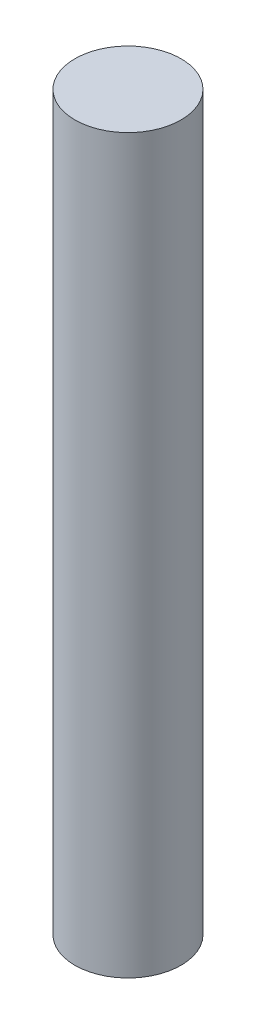
ISO-10303-21;
HEADER;
FILE_DESCRIPTION(('STEP AP214'),'2;1');
FILE_NAME('part.step','',(''),(''),'','','');
FILE_SCHEMA(('AUTOMOTIVE_DESIGN { 1 0 10303 214 1 1 1 1 }'));
ENDSEC;
DATA;
#1=APPLICATION_CONTEXT('core data for automotive mechanical design processes');
#2=APPLICATION_PROTOCOL_DEFINITION('international standard','automotive_design',2000,#1);
#3=PRODUCT_CONTEXT('',#1,'mechanical');
#4=PRODUCT('Part','Part','',(#3));
#5=PRODUCT_RELATED_PRODUCT_CATEGORY('part','',(#4));
#6=PRODUCT_DEFINITION_FORMATION('','',#4);
#7=PRODUCT_DEFINITION_CONTEXT('part definition',#1,'design');
#8=PRODUCT_DEFINITION('design','',#6,#7);
#9=PRODUCT_DEFINITION_SHAPE('','',#8);
#10=(LENGTH_UNIT() NAMED_UNIT(*) SI_UNIT(.MILLI.,.METRE.));
#11=(NAMED_UNIT(*) PLANE_ANGLE_UNIT() SI_UNIT($,.RADIAN.));
#12=(NAMED_UNIT(*) SI_UNIT($,.STERADIAN.) SOLID_ANGLE_UNIT());
#13=UNCERTAINTY_MEASURE_WITH_UNIT(LENGTH_MEASURE(1.E-05),#10,'distance_accuracy_value','');
#14=(GEOMETRIC_REPRESENTATION_CONTEXT(3) GLOBAL_UNCERTAINTY_ASSIGNED_CONTEXT((#13)) GLOBAL_UNIT_ASSIGNED_CONTEXT((#10,
#11,#12)) REPRESENTATION_CONTEXT('',''));
#15=CARTESIAN_POINT('',(0.,0.,0.));
#16=DIRECTION('',(0.,0.,1.));
#17=DIRECTION('',(1.,0.,0.));
#18=AXIS2_PLACEMENT_3D('',#15,#16,#17);
#19=CARTESIAN_POINT('',(0.,69.,0.));
#20=DIRECTION('',(0.,-1.,0.));
#21=DIRECTION('',(0.,0.,-1.));
#22=AXIS2_PLACEMENT_3D('',#19,#20,#21);
#23=CYLINDRICAL_SURFACE('',#22,5.);
#24=CARTESIAN_POINT('',(0.,69.,0.));
#25=DIRECTION('',(0.,1.,0.));
#26=DIRECTION('',(0.,0.,1.));
#27=AXIS2_PLACEMENT_3D('',#24,#25,#26);
#28=CIRCLE('',#27,5.);
#29=CARTESIAN_POINT('',(0.,69.,5.));
#30=VERTEX_POINT('',#29);
#31=EDGE_CURVE('E10',#30,#30,#28,.T.);
#32=ORIENTED_EDGE('',*,*,#31,.F.);
#33=EDGE_LOOP('',(#32));
#34=FACE_BOUND('',#33,.T.);
#35=CARTESIAN_POINT('',(0.,0.,0.));
#36=DIRECTION('',(0.,1.,0.));
#37=DIRECTION('',(0.,0.,1.));
#38=AXIS2_PLACEMENT_3D('',#35,#36,#37);
#39=CIRCLE('',#38,5.);
#40=CARTESIAN_POINT('',(0.,0.,5.));
#41=VERTEX_POINT('',#40);
#42=EDGE_CURVE('E40',#41,#41,#39,.T.);
#43=ORIENTED_EDGE('',*,*,#42,.T.);
#44=EDGE_LOOP('',(#43));
#45=FACE_BOUND('',#44,.T.);
#46=ADVANCED_FACE('F37',(#34,#45),#23,.T.);
#47=CARTESIAN_POINT('',(0.,69.,0.));
#48=DIRECTION('',(0.,1.,0.));
#49=DIRECTION('',(0.,0.,1.));
#50=AXIS2_PLACEMENT_3D('',#47,#48,#49);
#51=PLANE('',#50);
#52=ORIENTED_EDGE('',*,*,#31,.T.);
#53=EDGE_LOOP('',(#52));
#54=FACE_BOUND('',#53,.T.);
#55=ADVANCED_FACE('F54',(#54),#51,.T.);
#56=CARTESIAN_POINT('',(0.,0.,0.));
#57=DIRECTION('',(0.,1.,0.));
#58=DIRECTION('',(0.,0.,1.));
#59=AXIS2_PLACEMENT_3D('',#56,#57,#58);
#60=PLANE('',#59);
#61=ORIENTED_EDGE('',*,*,#42,.F.);
#62=EDGE_LOOP('',(#61));
#63=FACE_BOUND('',#62,.T.);
#64=ADVANCED_FACE('F52',(#63),#60,.F.);
#65=CLOSED_SHELL('',(#46,#55,#64));
#66=MANIFOLD_SOLID_BREP('B2',#65);
#67=ADVANCED_BREP_SHAPE_REPRESENTATION('',(#18,#66),#14);
#68=SHAPE_DEFINITION_REPRESENTATION(#9,#67);
ENDSEC;
END-ISO-10303-21;
